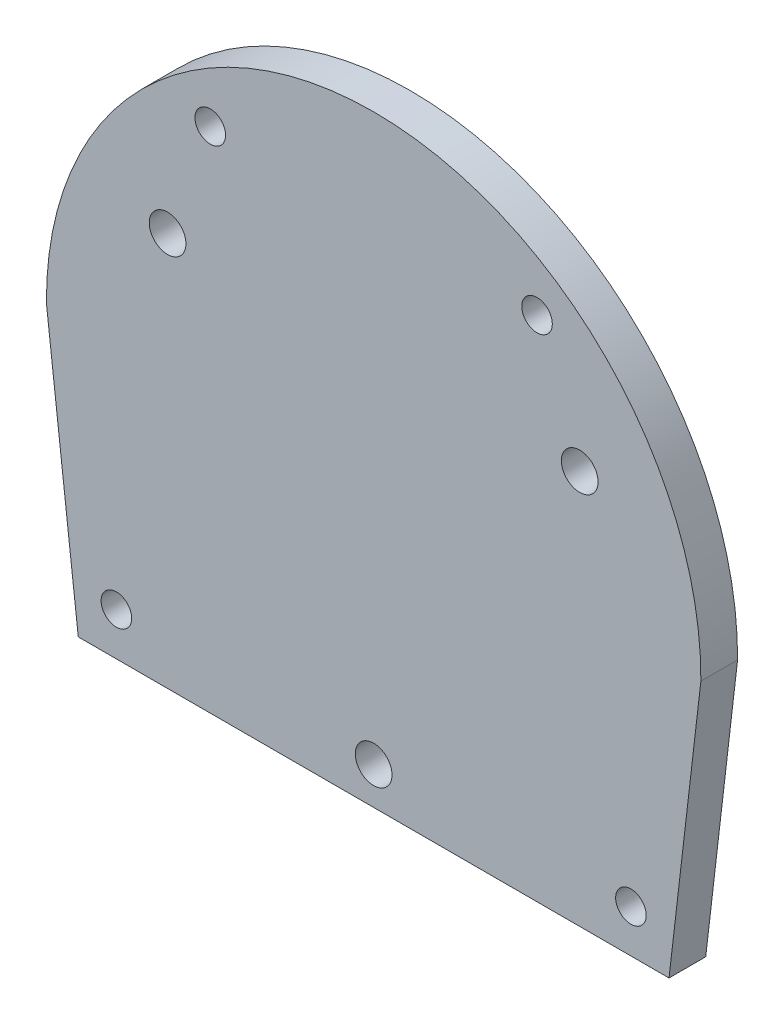
ISO-10303-21;
HEADER;
FILE_DESCRIPTION(('STEP AP214'),'2;1');
FILE_NAME('part.step','',(''),(''),'','','');
FILE_SCHEMA(('AUTOMOTIVE_DESIGN { 1 0 10303 214 1 1 1 1 }'));
ENDSEC;
DATA;
#1=APPLICATION_CONTEXT('core data for automotive mechanical design processes');
#2=APPLICATION_PROTOCOL_DEFINITION('international standard','automotive_design',2000,#1);
#3=PRODUCT_CONTEXT('',#1,'mechanical');
#4=PRODUCT('Part','Part','',(#3));
#5=PRODUCT_RELATED_PRODUCT_CATEGORY('part','',(#4));
#6=PRODUCT_DEFINITION_FORMATION('','',#4);
#7=PRODUCT_DEFINITION_CONTEXT('part definition',#1,'design');
#8=PRODUCT_DEFINITION('design','',#6,#7);
#9=PRODUCT_DEFINITION_SHAPE('','',#8);
#10=(LENGTH_UNIT() NAMED_UNIT(*) SI_UNIT(.MILLI.,.METRE.));
#11=(NAMED_UNIT(*) PLANE_ANGLE_UNIT() SI_UNIT($,.RADIAN.));
#12=(NAMED_UNIT(*) SI_UNIT($,.STERADIAN.) SOLID_ANGLE_UNIT());
#13=UNCERTAINTY_MEASURE_WITH_UNIT(LENGTH_MEASURE(1.E-05),#10,'distance_accuracy_value','');
#14=(GEOMETRIC_REPRESENTATION_CONTEXT(3) GLOBAL_UNCERTAINTY_ASSIGNED_CONTEXT((#13)) GLOBAL_UNIT_ASSIGNED_CONTEXT((#10,
#11,#12)) REPRESENTATION_CONTEXT('',''));
#15=CARTESIAN_POINT('',(0.,0.,0.));
#16=DIRECTION('',(0.,0.,1.));
#17=DIRECTION('',(1.,0.,0.));
#18=AXIS2_PLACEMENT_3D('',#15,#16,#17);
#19=CARTESIAN_POINT('',(-26.410866424661,-3.08126774954379,3.));
#20=DIRECTION('',(0.993263139087243,0.115880699560178,0.));
#21=DIRECTION('',(-0.115880699560178,0.993263139087243,0.));
#22=AXIS2_PLACEMENT_3D('',#19,#20,#21);
#23=PLANE('',#22);
#24=DIRECTION('',(0.115880699560178,-0.993263139087243,0.));
#25=VECTOR('',#24,1.);
#26=CARTESIAN_POINT('',(-26.410866424661,-3.08126774954379,0.));
#27=LINE('',#26,#25);
#28=CARTESIAN_POINT('',(-26.7493972419696,-0.17957502975642,0.));
#29=VERTEX_POINT('',#28);
#30=CARTESIAN_POINT('',(-24.1453476621078,-22.5,0.));
#31=VERTEX_POINT('',#30);
#32=EDGE_CURVE('E116',#29,#31,#27,.T.);
#33=ORIENTED_EDGE('',*,*,#32,.T.);
#34=DIRECTION('',(0.,0.,-1.));
#35=VECTOR('',#34,1.);
#36=CARTESIAN_POINT('',(-24.1453476621078,-22.5,3.));
#37=LINE('',#36,#35);
#38=CARTESIAN_POINT('',(-24.1453476621078,-22.5,3.));
#39=VERTEX_POINT('',#38);
#40=EDGE_CURVE('E11',#39,#31,#37,.T.);
#41=ORIENTED_EDGE('',*,*,#40,.F.);
#42=DIRECTION('',(0.115880699560178,-0.993263139087243,0.));
#43=VECTOR('',#42,1.);
#44=CARTESIAN_POINT('',(-26.410866424661,-3.08126774954379,3.));
#45=LINE('',#44,#43);
#46=CARTESIAN_POINT('',(-26.7493972419696,-0.17957502975642,3.));
#47=VERTEX_POINT('',#46);
#48=EDGE_CURVE('E91',#47,#39,#45,.T.);
#49=ORIENTED_EDGE('',*,*,#48,.F.);
#50=DIRECTION('',(0.,0.,-1.));
#51=VECTOR('',#50,1.);
#52=CARTESIAN_POINT('',(-26.7493972419696,-0.17957502975642,3.));
#53=LINE('',#52,#51);
#54=EDGE_CURVE('E103',#47,#29,#53,.T.);
#55=ORIENTED_EDGE('',*,*,#54,.T.);
#56=EDGE_LOOP('',(#33,#41,#49,#55));
#57=FACE_BOUND('',#56,.T.);
#58=ADVANCED_FACE('F41',(#57),#23,.F.);
#59=CARTESIAN_POINT('',(0.,-22.5,3.));
#60=DIRECTION('',(0.,1.,0.));
#61=DIRECTION('',(0.,0.,1.));
#62=AXIS2_PLACEMENT_3D('',#59,#60,#61);
#63=PLANE('',#62);
#64=DIRECTION('',(1.,0.,0.));
#65=VECTOR('',#64,1.);
#66=CARTESIAN_POINT('',(0.,-22.5,0.));
#67=LINE('',#66,#65);
#68=CARTESIAN_POINT('',(24.1453476621078,-22.5,0.));
#69=VERTEX_POINT('',#68);
#70=EDGE_CURVE('E96',#31,#69,#67,.T.);
#71=ORIENTED_EDGE('',*,*,#70,.T.);
#72=DIRECTION('',(0.,0.,-1.));
#73=VECTOR('',#72,1.);
#74=CARTESIAN_POINT('',(24.1453476621078,-22.5,3.));
#75=LINE('',#74,#73);
#76=CARTESIAN_POINT('',(24.1453476621078,-22.5,3.));
#77=VERTEX_POINT('',#76);
#78=EDGE_CURVE('E51',#77,#69,#75,.T.);
#79=ORIENTED_EDGE('',*,*,#78,.F.);
#80=DIRECTION('',(1.,0.,0.));
#81=VECTOR('',#80,1.);
#82=CARTESIAN_POINT('',(0.,-22.5,3.));
#83=LINE('',#82,#81);
#84=EDGE_CURVE('E86',#39,#77,#83,.T.);
#85=ORIENTED_EDGE('',*,*,#84,.F.);
#86=ORIENTED_EDGE('',*,*,#40,.T.);
#87=EDGE_LOOP('',(#71,#79,#85,#86));
#88=FACE_BOUND('',#87,.T.);
#89=ADVANCED_FACE('F95',(#88),#63,.F.);
#90=CARTESIAN_POINT('',(26.410866424661,-3.08126774954379,3.));
#91=DIRECTION('',(0.993263139087243,-0.115880699560178,0.));
#92=DIRECTION('',(0.115880699560178,0.993263139087243,0.));
#93=AXIS2_PLACEMENT_3D('',#90,#91,#92);
#94=PLANE('',#93);
#95=DIRECTION('',(-0.115880699560178,-0.993263139087243,0.));
#96=VECTOR('',#95,1.);
#97=CARTESIAN_POINT('',(26.410866424661,-3.08126774954379,0.));
#98=LINE('',#97,#96);
#99=CARTESIAN_POINT('',(26.7493972419696,-0.17957502975642,0.));
#100=VERTEX_POINT('',#99);
#101=EDGE_CURVE('E120',#100,#69,#98,.T.);
#102=ORIENTED_EDGE('',*,*,#101,.F.);
#103=DIRECTION('',(0.,0.,-1.));
#104=VECTOR('',#103,1.);
#105=CARTESIAN_POINT('',(26.7493972419696,-0.17957502975642,3.));
#106=LINE('',#105,#104);
#107=CARTESIAN_POINT('',(26.7493972419696,-0.17957502975642,3.));
#108=VERTEX_POINT('',#107);
#109=EDGE_CURVE('E76',#108,#100,#106,.T.);
#110=ORIENTED_EDGE('',*,*,#109,.F.);
#111=DIRECTION('',(-0.115880699560178,-0.993263139087243,0.));
#112=VECTOR('',#111,1.);
#113=CARTESIAN_POINT('',(26.410866424661,-3.08126774954379,3.));
#114=LINE('',#113,#112);
#115=EDGE_CURVE('E89',#108,#77,#114,.T.);
#116=ORIENTED_EDGE('',*,*,#115,.T.);
#117=ORIENTED_EDGE('',*,*,#78,.T.);
#118=EDGE_LOOP('',(#102,#110,#116,#117));
#119=FACE_BOUND('',#118,.T.);
#120=ADVANCED_FACE('F101',(#119),#94,.T.);
#121=CARTESIAN_POINT('',(0.,-19.45,3.));
#122=DIRECTION('',(0.,0.,-1.));
#123=DIRECTION('',(-1.,0.,0.));
#124=AXIS2_PLACEMENT_3D('',#121,#122,#123);
#125=CYLINDRICAL_SURFACE('',#124,1.5);
#126=CARTESIAN_POINT('',(0.,-19.45,3.));
#127=DIRECTION('',(0.,0.,1.));
#128=DIRECTION('',(1.,0.,0.));
#129=AXIS2_PLACEMENT_3D('',#126,#127,#128);
#130=CIRCLE('',#129,1.5);
#131=CARTESIAN_POINT('',(1.5,-19.45,3.));
#132=VERTEX_POINT('',#131);
#133=EDGE_CURVE('E289',#132,#132,#130,.T.);
#134=ORIENTED_EDGE('',*,*,#133,.T.);
#135=EDGE_LOOP('',(#134));
#136=FACE_BOUND('',#135,.T.);
#137=CARTESIAN_POINT('',(0.,-19.45,0.));
#138=DIRECTION('',(0.,0.,1.));
#139=DIRECTION('',(1.,0.,0.));
#140=AXIS2_PLACEMENT_3D('',#137,#138,#139);
#141=CIRCLE('',#140,1.5);
#142=CARTESIAN_POINT('',(1.5,-19.45,0.));
#143=VERTEX_POINT('',#142);
#144=EDGE_CURVE('E113',#143,#143,#141,.T.);
#145=ORIENTED_EDGE('',*,*,#144,.F.);
#146=EDGE_LOOP('',(#145));
#147=FACE_BOUND('',#146,.T.);
#148=ADVANCED_FACE('F162',(#136,#147),#125,.F.);
#149=CARTESIAN_POINT('',(16.8441941036074,9.72499999999996,3.));
#150=DIRECTION('',(0.,0.,-1.));
#151=DIRECTION('',(-1.,0.,0.));
#152=AXIS2_PLACEMENT_3D('',#149,#150,#151);
#153=CYLINDRICAL_SURFACE('',#152,1.5);
#154=CARTESIAN_POINT('',(16.8441941036074,9.72499999999996,3.));
#155=DIRECTION('',(0.,0.,1.));
#156=DIRECTION('',(1.,0.,0.));
#157=AXIS2_PLACEMENT_3D('',#154,#155,#156);
#158=CIRCLE('',#157,1.5);
#159=CARTESIAN_POINT('',(18.3441941036074,9.72499999999996,3.));
#160=VERTEX_POINT('',#159);
#161=EDGE_CURVE('E176',#160,#160,#158,.T.);
#162=ORIENTED_EDGE('',*,*,#161,.T.);
#163=EDGE_LOOP('',(#162));
#164=FACE_BOUND('',#163,.T.);
#165=CARTESIAN_POINT('',(16.8441941036074,9.72499999999996,0.));
#166=DIRECTION('',(0.,0.,1.));
#167=DIRECTION('',(1.,0.,0.));
#168=AXIS2_PLACEMENT_3D('',#165,#166,#167);
#169=CIRCLE('',#168,1.5);
#170=CARTESIAN_POINT('',(18.3441941036074,9.72499999999996,0.));
#171=VERTEX_POINT('',#170);
#172=EDGE_CURVE('E110',#171,#171,#169,.T.);
#173=ORIENTED_EDGE('',*,*,#172,.F.);
#174=EDGE_LOOP('',(#173));
#175=FACE_BOUND('',#174,.T.);
#176=ADVANCED_FACE('F164',(#164,#175),#153,.F.);
#177=CARTESIAN_POINT('',(-16.8441941036074,9.72499999999996,3.));
#178=DIRECTION('',(0.,0.,-1.));
#179=DIRECTION('',(-1.,0.,0.));
#180=AXIS2_PLACEMENT_3D('',#177,#178,#179);
#181=CYLINDRICAL_SURFACE('',#180,1.50000000000001);
#182=CARTESIAN_POINT('',(-16.8441941036074,9.72499999999996,3.));
#183=DIRECTION('',(0.,0.,1.));
#184=DIRECTION('',(1.,0.,0.));
#185=AXIS2_PLACEMENT_3D('',#182,#183,#184);
#186=CIRCLE('',#185,1.50000000000001);
#187=CARTESIAN_POINT('',(-15.3441941036074,9.72499999999996,3.));
#188=VERTEX_POINT('',#187);
#189=EDGE_CURVE('E123',#188,#188,#186,.T.);
#190=ORIENTED_EDGE('',*,*,#189,.T.);
#191=EDGE_LOOP('',(#190));
#192=FACE_BOUND('',#191,.T.);
#193=CARTESIAN_POINT('',(-16.8441941036074,9.72499999999996,0.));
#194=DIRECTION('',(0.,0.,1.));
#195=DIRECTION('',(1.,0.,0.));
#196=AXIS2_PLACEMENT_3D('',#193,#194,#195);
#197=CIRCLE('',#196,1.50000000000001);
#198=CARTESIAN_POINT('',(-15.3441941036074,9.72499999999996,0.));
#199=VERTEX_POINT('',#198);
#200=EDGE_CURVE('E107',#199,#199,#197,.T.);
#201=ORIENTED_EDGE('',*,*,#200,.F.);
#202=EDGE_LOOP('',(#201));
#203=FACE_BOUND('',#202,.T.);
#204=ADVANCED_FACE('F43',(#192,#203),#181,.F.);
#205=CARTESIAN_POINT('',(0.,0.,3.));
#206=DIRECTION('',(0.,0.,-1.));
#207=DIRECTION('',(-1.,0.,0.));
#208=AXIS2_PLACEMENT_3D('',#205,#206,#207);
#209=CYLINDRICAL_SURFACE('',#208,26.75);
#210=CARTESIAN_POINT('',(0.,0.,0.));
#211=DIRECTION('',(0.,0.,1.));
#212=DIRECTION('',(1.,0.,0.));
#213=AXIS2_PLACEMENT_3D('',#210,#211,#212);
#214=CIRCLE('',#213,26.75);
#215=EDGE_CURVE('E79',#100,#29,#214,.T.);
#216=ORIENTED_EDGE('',*,*,#215,.T.);
#217=ORIENTED_EDGE('',*,*,#54,.F.);
#218=CARTESIAN_POINT('',(0.,0.,3.));
#219=DIRECTION('',(0.,0.,1.));
#220=DIRECTION('',(1.,0.,0.));
#221=AXIS2_PLACEMENT_3D('',#218,#219,#220);
#222=CIRCLE('',#221,26.75);
#223=EDGE_CURVE('E60',#108,#47,#222,.T.);
#224=ORIENTED_EDGE('',*,*,#223,.F.);
#225=ORIENTED_EDGE('',*,*,#109,.T.);
#226=EDGE_LOOP('',(#216,#217,#224,#225));
#227=FACE_BOUND('',#226,.T.);
#228=ADVANCED_FACE('F171',(#227),#209,.T.);
#229=CARTESIAN_POINT('',(0.,0.,3.));
#230=DIRECTION('',(0.,0.,1.));
#231=DIRECTION('',(1.,0.,0.));
#232=AXIS2_PLACEMENT_3D('',#229,#230,#231);
#233=PLANE('',#232);
#234=CARTESIAN_POINT('',(21.0297909489661,-19.001295205851,3.));
#235=DIRECTION('',(0.,0.,1.));
#236=DIRECTION('',(1.,0.,0.));
#237=AXIS2_PLACEMENT_3D('',#234,#235,#236);
#238=CIRCLE('',#237,1.25);
#239=CARTESIAN_POINT('',(22.2797909489661,-19.001295205851,3.));
#240=VERTEX_POINT('',#239);
#241=EDGE_CURVE('E130',#240,#240,#238,.T.);
#242=ORIENTED_EDGE('',*,*,#241,.F.);
#243=EDGE_LOOP('',(#242));
#244=FACE_BOUND('',#243,.T.);
#245=CARTESIAN_POINT('',(13.3548466594478,19.0318304611679,3.));
#246=DIRECTION('',(0.,0.,1.));
#247=DIRECTION('',(1.,0.,0.));
#248=AXIS2_PLACEMENT_3D('',#245,#246,#247);
#249=CIRCLE('',#248,1.25);
#250=CARTESIAN_POINT('',(14.6048466594478,19.0318304611679,3.));
#251=VERTEX_POINT('',#250);
#252=EDGE_CURVE('E277',#251,#251,#249,.T.);
#253=ORIENTED_EDGE('',*,*,#252,.F.);
#254=EDGE_LOOP('',(#253));
#255=FACE_BOUND('',#254,.T.);
#256=CARTESIAN_POINT('',(-13.3548466594478,19.0318304611679,3.));
#257=DIRECTION('',(0.,0.,1.));
#258=DIRECTION('',(1.,0.,0.));
#259=AXIS2_PLACEMENT_3D('',#256,#257,#258);
#260=CIRCLE('',#259,1.25);
#261=CARTESIAN_POINT('',(-12.1048466594478,19.0318304611679,3.));
#262=VERTEX_POINT('',#261);
#263=EDGE_CURVE('E267',#262,#262,#260,.T.);
#264=ORIENTED_EDGE('',*,*,#263,.F.);
#265=EDGE_LOOP('',(#264));
#266=FACE_BOUND('',#265,.T.);
#267=CARTESIAN_POINT('',(-21.0297909489661,-19.001295205851,3.));
#268=DIRECTION('',(0.,0.,1.));
#269=DIRECTION('',(1.,0.,0.));
#270=AXIS2_PLACEMENT_3D('',#267,#268,#269);
#271=CIRCLE('',#270,1.25);
#272=CARTESIAN_POINT('',(-19.7797909489661,-19.001295205851,3.));
#273=VERTEX_POINT('',#272);
#274=EDGE_CURVE('E278',#273,#273,#271,.T.);
#275=ORIENTED_EDGE('',*,*,#274,.F.);
#276=EDGE_LOOP('',(#275));
#277=FACE_BOUND('',#276,.T.);
#278=ORIENTED_EDGE('',*,*,#189,.F.);
#279=EDGE_LOOP('',(#278));
#280=FACE_BOUND('',#279,.T.);
#281=ORIENTED_EDGE('',*,*,#161,.F.);
#282=EDGE_LOOP('',(#281));
#283=FACE_BOUND('',#282,.T.);
#284=ORIENTED_EDGE('',*,*,#133,.F.);
#285=EDGE_LOOP('',(#284));
#286=FACE_BOUND('',#285,.T.);
#287=ORIENTED_EDGE('',*,*,#48,.T.);
#288=ORIENTED_EDGE('',*,*,#84,.T.);
#289=ORIENTED_EDGE('',*,*,#115,.F.);
#290=ORIENTED_EDGE('',*,*,#223,.T.);
#291=EDGE_LOOP('',(#287,#288,#289,#290));
#292=FACE_BOUND('',#291,.T.);
#293=ADVANCED_FACE('F87',(#244,#255,#266,#277,#280,#283,#286,#292),#233,.T.);
#294=CARTESIAN_POINT('',(0.,0.,0.));
#295=DIRECTION('',(0.,0.,1.));
#296=DIRECTION('',(1.,0.,0.));
#297=AXIS2_PLACEMENT_3D('',#294,#295,#296);
#298=PLANE('',#297);
#299=CARTESIAN_POINT('',(21.0297909489661,-19.001295205851,0.));
#300=DIRECTION('',(0.,0.,1.));
#301=DIRECTION('',(1.,0.,0.));
#302=AXIS2_PLACEMENT_3D('',#299,#300,#301);
#303=CIRCLE('',#302,1.25);
#304=CARTESIAN_POINT('',(22.2797909489661,-19.001295205851,0.));
#305=VERTEX_POINT('',#304);
#306=EDGE_CURVE('E45',#305,#305,#303,.T.);
#307=ORIENTED_EDGE('',*,*,#306,.T.);
#308=EDGE_LOOP('',(#307));
#309=FACE_BOUND('',#308,.T.);
#310=CARTESIAN_POINT('',(13.3548466594478,19.0318304611679,0.));
#311=DIRECTION('',(0.,0.,1.));
#312=DIRECTION('',(1.,0.,0.));
#313=AXIS2_PLACEMENT_3D('',#310,#311,#312);
#314=CIRCLE('',#313,1.25);
#315=CARTESIAN_POINT('',(14.6048466594478,19.0318304611679,0.));
#316=VERTEX_POINT('',#315);
#317=EDGE_CURVE('E132',#316,#316,#314,.T.);
#318=ORIENTED_EDGE('',*,*,#317,.T.);
#319=EDGE_LOOP('',(#318));
#320=FACE_BOUND('',#319,.T.);
#321=CARTESIAN_POINT('',(-13.3548466594478,19.0318304611679,0.));
#322=DIRECTION('',(0.,0.,1.));
#323=DIRECTION('',(1.,0.,0.));
#324=AXIS2_PLACEMENT_3D('',#321,#322,#323);
#325=CIRCLE('',#324,1.25);
#326=CARTESIAN_POINT('',(-12.1048466594478,19.0318304611679,0.));
#327=VERTEX_POINT('',#326);
#328=EDGE_CURVE('E129',#327,#327,#325,.T.);
#329=ORIENTED_EDGE('',*,*,#328,.T.);
#330=EDGE_LOOP('',(#329));
#331=FACE_BOUND('',#330,.T.);
#332=CARTESIAN_POINT('',(-21.0297909489661,-19.001295205851,0.));
#333=DIRECTION('',(0.,0.,1.));
#334=DIRECTION('',(1.,0.,0.));
#335=AXIS2_PLACEMENT_3D('',#332,#333,#334);
#336=CIRCLE('',#335,1.25);
#337=CARTESIAN_POINT('',(-19.7797909489661,-19.001295205851,0.));
#338=VERTEX_POINT('',#337);
#339=EDGE_CURVE('E126',#338,#338,#336,.T.);
#340=ORIENTED_EDGE('',*,*,#339,.T.);
#341=EDGE_LOOP('',(#340));
#342=FACE_BOUND('',#341,.T.);
#343=ORIENTED_EDGE('',*,*,#200,.T.);
#344=EDGE_LOOP('',(#343));
#345=FACE_BOUND('',#344,.T.);
#346=ORIENTED_EDGE('',*,*,#172,.T.);
#347=EDGE_LOOP('',(#346));
#348=FACE_BOUND('',#347,.T.);
#349=ORIENTED_EDGE('',*,*,#144,.T.);
#350=EDGE_LOOP('',(#349));
#351=FACE_BOUND('',#350,.T.);
#352=ORIENTED_EDGE('',*,*,#32,.F.);
#353=ORIENTED_EDGE('',*,*,#215,.F.);
#354=ORIENTED_EDGE('',*,*,#101,.T.);
#355=ORIENTED_EDGE('',*,*,#70,.F.);
#356=EDGE_LOOP('',(#352,#353,#354,#355));
#357=FACE_BOUND('',#356,.T.);
#358=ADVANCED_FACE('F139',(#309,#320,#331,#342,#345,#348,#351,#357),#298,.F.);
#359=CARTESIAN_POINT('',(-21.0297909489661,-19.001295205851,-7.));
#360=DIRECTION('',(0.,0.,1.));
#361=DIRECTION('',(1.,0.,0.));
#362=AXIS2_PLACEMENT_3D('',#359,#360,#361);
#363=CYLINDRICAL_SURFACE('',#362,1.25);
#364=ORIENTED_EDGE('',*,*,#274,.T.);
#365=EDGE_LOOP('',(#364));
#366=FACE_BOUND('',#365,.T.);
#367=ORIENTED_EDGE('',*,*,#339,.F.);
#368=EDGE_LOOP('',(#367));
#369=FACE_BOUND('',#368,.T.);
#370=ADVANCED_FACE('F181',(#366,#369),#363,.F.);
#371=CARTESIAN_POINT('',(-13.3548466594478,19.0318304611679,-7.));
#372=DIRECTION('',(0.,0.,1.));
#373=DIRECTION('',(1.,0.,0.));
#374=AXIS2_PLACEMENT_3D('',#371,#372,#373);
#375=CYLINDRICAL_SURFACE('',#374,1.25);
#376=ORIENTED_EDGE('',*,*,#263,.T.);
#377=EDGE_LOOP('',(#376));
#378=FACE_BOUND('',#377,.T.);
#379=ORIENTED_EDGE('',*,*,#328,.F.);
#380=EDGE_LOOP('',(#379));
#381=FACE_BOUND('',#380,.T.);
#382=ADVANCED_FACE('F149',(#378,#381),#375,.F.);
#383=CARTESIAN_POINT('',(13.3548466594478,19.0318304611679,-7.));
#384=DIRECTION('',(0.,0.,1.));
#385=DIRECTION('',(1.,0.,0.));
#386=AXIS2_PLACEMENT_3D('',#383,#384,#385);
#387=CYLINDRICAL_SURFACE('',#386,1.25);
#388=ORIENTED_EDGE('',*,*,#252,.T.);
#389=EDGE_LOOP('',(#388));
#390=FACE_BOUND('',#389,.T.);
#391=ORIENTED_EDGE('',*,*,#317,.F.);
#392=EDGE_LOOP('',(#391));
#393=FACE_BOUND('',#392,.T.);
#394=ADVANCED_FACE('F143',(#390,#393),#387,.F.);
#395=CARTESIAN_POINT('',(21.0297909489661,-19.001295205851,-7.));
#396=DIRECTION('',(0.,0.,1.));
#397=DIRECTION('',(1.,0.,0.));
#398=AXIS2_PLACEMENT_3D('',#395,#396,#397);
#399=CYLINDRICAL_SURFACE('',#398,1.25);
#400=ORIENTED_EDGE('',*,*,#241,.T.);
#401=EDGE_LOOP('',(#400));
#402=FACE_BOUND('',#401,.T.);
#403=ORIENTED_EDGE('',*,*,#306,.F.);
#404=EDGE_LOOP('',(#403));
#405=FACE_BOUND('',#404,.T.);
#406=ADVANCED_FACE('F141',(#402,#405),#399,.F.);
#407=CLOSED_SHELL('',(#58,#89,#120,#148,#176,#204,#228,#293,#358,#370,#382,#394,#406));
#408=MANIFOLD_SOLID_BREP('B2',#407);
#409=ADVANCED_BREP_SHAPE_REPRESENTATION('',(#18,#408),#14);
#410=SHAPE_DEFINITION_REPRESENTATION(#9,#409);
ENDSEC;
END-ISO-10303-21;
